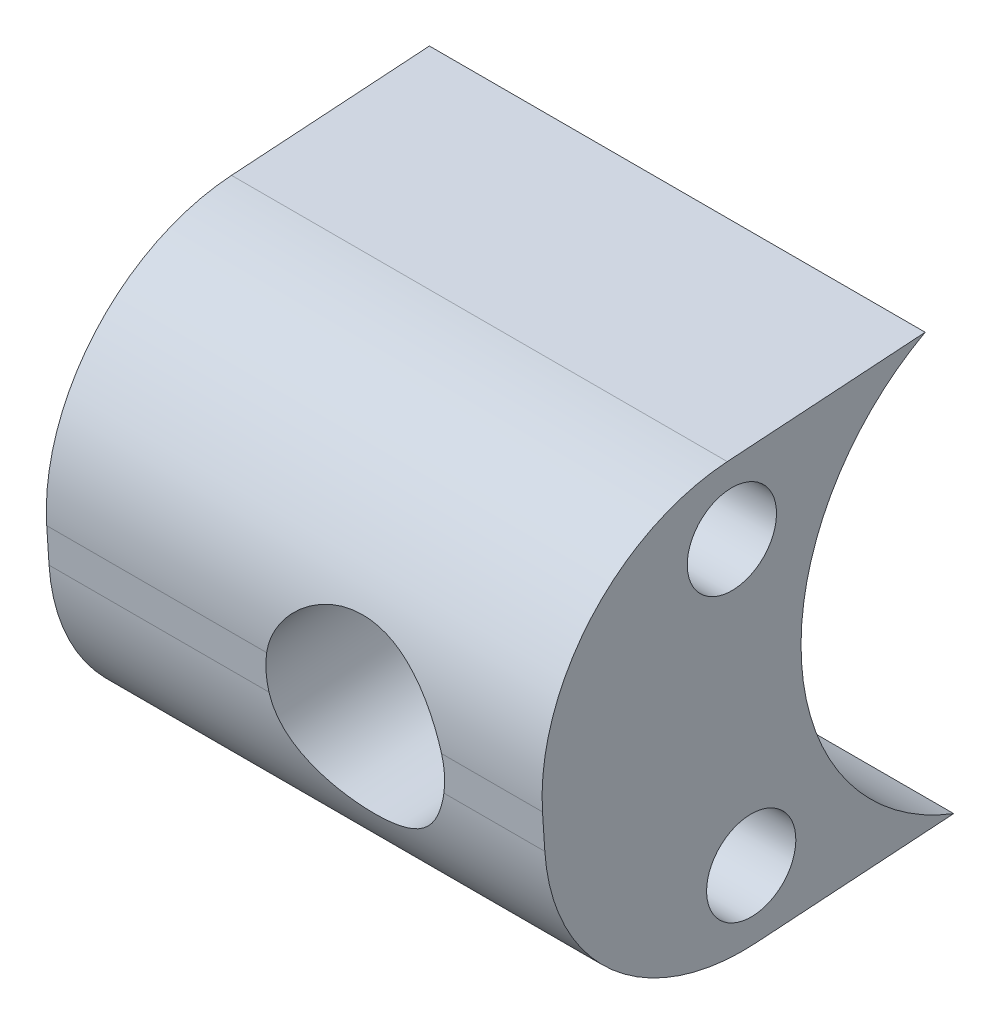
ISO-10303-21;
HEADER;
FILE_DESCRIPTION(('STEP AP214'),'2;1');
FILE_NAME('part.step','',(''),(''),'','','');
FILE_SCHEMA(('AUTOMOTIVE_DESIGN { 1 0 10303 214 1 1 1 1 }'));
ENDSEC;
DATA;
#1=APPLICATION_CONTEXT('core data for automotive mechanical design processes');
#2=APPLICATION_PROTOCOL_DEFINITION('international standard','automotive_design',2000,#1);
#3=PRODUCT_CONTEXT('',#1,'mechanical');
#4=PRODUCT('Part','Part','',(#3));
#5=PRODUCT_RELATED_PRODUCT_CATEGORY('part','',(#4));
#6=PRODUCT_DEFINITION_FORMATION('','',#4);
#7=PRODUCT_DEFINITION_CONTEXT('part definition',#1,'design');
#8=PRODUCT_DEFINITION('design','',#6,#7);
#9=PRODUCT_DEFINITION_SHAPE('','',#8);
#10=(LENGTH_UNIT() NAMED_UNIT(*) SI_UNIT(.MILLI.,.METRE.));
#11=(NAMED_UNIT(*) PLANE_ANGLE_UNIT() SI_UNIT($,.RADIAN.));
#12=(NAMED_UNIT(*) SI_UNIT($,.STERADIAN.) SOLID_ANGLE_UNIT());
#13=UNCERTAINTY_MEASURE_WITH_UNIT(LENGTH_MEASURE(1.E-05),#10,'distance_accuracy_value','');
#14=(GEOMETRIC_REPRESENTATION_CONTEXT(3) GLOBAL_UNCERTAINTY_ASSIGNED_CONTEXT((#13)) GLOBAL_UNIT_ASSIGNED_CONTEXT((#10,
#11,#12)) REPRESENTATION_CONTEXT('',''));
#15=CARTESIAN_POINT('',(0.,0.,0.));
#16=DIRECTION('',(0.,0.,1.));
#17=DIRECTION('',(1.,0.,0.));
#18=AXIS2_PLACEMENT_3D('',#15,#16,#17);
#19=CARTESIAN_POINT('',(15.,38.3574216780718,84.6947004439507));
#20=DIRECTION('',(-1.,0.,0.));
#21=DIRECTION('',(0.,-1.,0.));
#22=AXIS2_PLACEMENT_3D('',#19,#20,#21);
#23=CYLINDRICAL_SURFACE('',#22,0.999999999999998);
#24=CARTESIAN_POINT('',(-10.,38.3574216780718,84.6947004439507));
#25=DIRECTION('',(-1.,0.,0.));
#26=DIRECTION('',(0.,-1.,0.));
#27=AXIS2_PLACEMENT_3D('',#24,#25,#26);
#28=CIRCLE('',#27,0.999999999999998);
#29=CARTESIAN_POINT('',(-10.,37.3574216780718,84.6947004439507));
#30=VERTEX_POINT('',#29);
#31=EDGE_CURVE('E174',#30,#30,#28,.T.);
#32=ORIENTED_EDGE('',*,*,#31,.T.);
#33=EDGE_LOOP('',(#32));
#34=FACE_BOUND('',#33,.T.);
#35=CARTESIAN_POINT('',(2.,38.3574216780718,84.6947004439507));
#36=DIRECTION('',(1.,0.,0.));
#37=DIRECTION('',(0.,1.,0.));
#38=AXIS2_PLACEMENT_3D('',#35,#36,#37);
#39=CIRCLE('',#38,0.999999999999998);
#40=CARTESIAN_POINT('',(2.,39.3574216780718,84.6947004439507));
#41=VERTEX_POINT('',#40);
#42=EDGE_CURVE('E49',#41,#41,#39,.F.);
#43=ORIENTED_EDGE('',*,*,#42,.F.);
#44=EDGE_LOOP('',(#43));
#45=FACE_BOUND('',#44,.T.);
#46=ADVANCED_FACE('F44',(#34,#45),#23,.F.);
#47=CARTESIAN_POINT('',(15.,53.0940315580643,85.669468508596));
#48=DIRECTION('',(-1.,0.,0.));
#49=DIRECTION('',(0.,-1.,0.));
#50=AXIS2_PLACEMENT_3D('',#47,#48,#49);
#51=CYLINDRICAL_SURFACE('',#50,0.999999999999998);
#52=CARTESIAN_POINT('',(-10.,53.0940315580643,85.669468508596));
#53=DIRECTION('',(-1.,0.,0.));
#54=DIRECTION('',(0.,-1.,0.));
#55=AXIS2_PLACEMENT_3D('',#52,#53,#54);
#56=CIRCLE('',#55,0.999999999999998);
#57=CARTESIAN_POINT('',(-10.,52.0940315580643,85.669468508596));
#58=VERTEX_POINT('',#57);
#59=EDGE_CURVE('E189',#58,#58,#56,.T.);
#60=ORIENTED_EDGE('',*,*,#59,.T.);
#61=EDGE_LOOP('',(#60));
#62=FACE_BOUND('',#61,.T.);
#63=CARTESIAN_POINT('',(2.,53.0940315580643,85.669468508596));
#64=DIRECTION('',(1.,0.,0.));
#65=DIRECTION('',(0.,1.,0.));
#66=AXIS2_PLACEMENT_3D('',#63,#64,#65);
#67=CIRCLE('',#66,0.999999999999998);
#68=CARTESIAN_POINT('',(2.,54.0940315580643,85.669468508596));
#69=VERTEX_POINT('',#68);
#70=EDGE_CURVE('E168',#69,#69,#67,.F.);
#71=ORIENTED_EDGE('',*,*,#70,.F.);
#72=EDGE_LOOP('',(#71));
#73=FACE_BOUND('',#72,.T.);
#74=ADVANCED_FACE('F243',(#62,#73),#51,.F.);
#75=CARTESIAN_POINT('',(15.,44.83380683333,85.1230875340005));
#76=DIRECTION('',(-1.,0.,0.));
#77=DIRECTION('',(0.,-1.,0.));
#78=AXIS2_PLACEMENT_3D('',#75,#76,#77);
#79=CYLINDRICAL_SURFACE('',#78,10.);
#80=CARTESIAN_POINT('',(1.08967138884241,44.1737889625631,95.1012825817167));
#81=CARTESIAN_POINT('',(1.11396025224883,44.0541213979482,95.0933850008602));
#82=CARTESIAN_POINT('',(1.14317009994851,43.9356138283809,95.0833665741199));
#83=CARTESIAN_POINT('',(1.21110469602797,43.7018064375716,95.0594995464776));
#84=CARTESIAN_POINT('',(1.24982536628847,43.5865052649948,95.0456525868827));
#85=CARTESIAN_POINT('',(1.3363225034484,43.3602956349309,95.0145876343883));
#86=CARTESIAN_POINT('',(1.38406642874332,43.2493730725805,94.9973817480445));
#87=CARTESIAN_POINT('',(1.48827412981522,43.0322361141684,94.9600838324072));
#88=CARTESIAN_POINT('',(1.54473860925532,42.9260220989312,94.9399915702206));
#89=CARTESIAN_POINT('',(1.72642155145603,42.6157054631113,94.8762632679071));
#90=CARTESIAN_POINT('',(1.86411584633579,42.4194444069645,94.8291055008529));
#91=CARTESIAN_POINT('',(2.16885626868298,42.0524501245451,94.7303940598669));
#92=CARTESIAN_POINT('',(2.33592910344768,41.8817403899959,94.6788364082488));
#93=CARTESIAN_POINT('',(2.70403894676532,41.5618037131869,94.5742063280678));
#94=CARTESIAN_POINT('',(2.90630971320346,41.4139769970336,94.5211777933535));
#95=CARTESIAN_POINT('',(3.3339409039677,41.1534640342692,94.4222577317884));
#96=CARTESIAN_POINT('',(3.55930102269774,41.040777322647,94.3763661104981));
#97=CARTESIAN_POINT('',(4.03015549333476,40.8526367143164,94.2970122979337));
#98=CARTESIAN_POINT('',(4.27584300924976,40.7776032851871,94.2636914599594));
#99=CARTESIAN_POINT('',(4.77793402847609,40.6694017690848,94.2149160823838));
#100=CARTESIAN_POINT('',(5.03433123879787,40.6362094441867,94.1994511995319));
#101=CARTESIAN_POINT('',(5.53380736234976,40.613717815865,94.1890104041689));
#102=CARTESIAN_POINT('',(5.77675002787525,40.621876557938,94.1928478170947));
#103=CARTESIAN_POINT('',(6.25747379314434,40.675959916093,94.2177658534219));
#104=CARTESIAN_POINT('',(6.49525475155304,40.7218855649512,94.2388469483701));
#105=CARTESIAN_POINT('',(6.95491021084694,40.8487279942179,94.2949904425765));
#106=CARTESIAN_POINT('',(7.17699062365971,40.9290165799428,94.3298009949681));
#107=CARTESIAN_POINT('',(7.60458371793245,41.1221698318604,94.4093466809176));
#108=CARTESIAN_POINT('',(7.81009217671615,41.2350427674801,94.4540843331591));
#109=CARTESIAN_POINT('',(8.21160292479085,41.4982477485836,94.5514943550375));
#110=CARTESIAN_POINT('',(8.40634469177015,41.6503856747501,94.6044778914918));
#111=CARTESIAN_POINT('',(8.76801740255451,41.9851738602378,94.710371039208));
#112=CARTESIAN_POINT('',(8.93493169383607,42.1678422596258,94.7632805875504));
#113=CARTESIAN_POINT('',(9.16324915465894,42.4645333722444,94.8389228746239));
#114=CARTESIAN_POINT('',(9.23661897500271,42.5689893172815,94.8638667883204));
#115=CARTESIAN_POINT('',(9.37417325180732,42.7842661182192,94.9114227776624));
#116=CARTESIAN_POINT('',(9.43836163553839,42.8950842241705,94.9340358491395));
#117=CARTESIAN_POINT('',(9.55690452874422,43.1221674370995,94.9761890877605));
#118=CARTESIAN_POINT('',(9.61127544013796,43.2384230427179,94.9957343729335));
#119=CARTESIAN_POINT('',(9.70979317743557,43.4756666755635,95.0311559578355));
#120=CARTESIAN_POINT('',(9.75394637322555,43.5966516991003,95.0470345434298));
#121=CARTESIAN_POINT('',(9.81633736935239,43.7940369290115,95.0691675061754));
#122=CARTESIAN_POINT('',(9.83793556159174,43.869244595736,95.0767501591257));
#123=CARTESIAN_POINT('',(9.87713343309136,44.0207390552473,95.0902690555518));
#124=CARTESIAN_POINT('',(9.89473808502419,44.0970243789548,95.0962073486072));
#125=CARTESIAN_POINT('',(9.9103286111576,44.1737889625631,95.1012825817167));
#126=B_SPLINE_CURVE_WITH_KNOTS('',3,(#80,#81,#82,#83,#84,#85,#86,#87,#88,#89,#90,#91,#92,#93,
#94,#95,#96,#97,#98,#99,#100,#101,#102,#103,#104,#105,#106,#107,#108,#109,#110,#111,#112,#113,
#114,#115,#116,#117,#118,#119,#120,#121,#122,#123,#124,#125),.UNSPECIFIED.,.F.,.F.,(4,2,2,2,2,2,
2,2,2,2,2,2,2,2,2,2,2,2,2,2,2,2,4),(0.,0.36693523797522,0.733713412629058,1.09919323765703,
1.46470256874171,2.19417112472514,2.9243062834031,3.68901878777467,4.45372117220255,
5.22678273239869,5.99939626350478,6.72511322140514,7.4508500254675,8.16385103865879,
8.87703316029591,9.63196002795654,10.3873370500176,10.7771108132416,11.1667173527464,
11.5556668345992,11.9443731819975,12.1801000007903,12.4155316663247),.UNSPECIFIED.);
#127=CARTESIAN_POINT('',(1.08967138884241,44.1737889625631,95.1012825817167));
#128=VERTEX_POINT('',#127);
#129=CARTESIAN_POINT('',(9.91032861115759,44.1737889625631,95.1012825817167));
#130=VERTEX_POINT('',#129);
#131=EDGE_CURVE('E61',#128,#130,#126,.T.);
#132=ORIENTED_EDGE('',*,*,#131,.F.);
#133=DIRECTION('',(-1.,0.,0.));
#134=VECTOR('',#133,1.);
#135=CARTESIAN_POINT('',(15.,44.1737889625631,95.1012825817167));
#136=LINE('',#135,#134);
#137=CARTESIAN_POINT('',(-10.,44.1737889625631,95.1012825817167));
#138=VERTEX_POINT('',#137);
#139=EDGE_CURVE('E97',#128,#138,#136,.T.);
#140=ORIENTED_EDGE('',*,*,#139,.T.);
#141=CARTESIAN_POINT('',(-10.,44.83380683333,85.1230875340005));
#142=DIRECTION('',(1.,0.,0.));
#143=DIRECTION('',(0.,1.,0.));
#144=AXIS2_PLACEMENT_3D('',#141,#142,#143);
#145=CIRCLE('',#144,10.);
#146=CARTESIAN_POINT('',(-10.,34.8556117856138,84.4630696632336));
#147=VERTEX_POINT('',#146);
#148=EDGE_CURVE('E145',#138,#147,#145,.T.);
#149=ORIENTED_EDGE('',*,*,#148,.T.);
#150=DIRECTION('',(-1.,0.,0.));
#151=VECTOR('',#150,1.);
#152=CARTESIAN_POINT('',(15.,34.8556117856138,84.4630696632336));
#153=LINE('',#152,#151);
#154=CARTESIAN_POINT('',(15.,34.8556117856138,84.4630696632336));
#155=VERTEX_POINT('',#154);
#156=EDGE_CURVE('E167',#155,#147,#153,.T.);
#157=ORIENTED_EDGE('',*,*,#156,.F.);
#158=CARTESIAN_POINT('',(15.,44.83380683333,85.1230875340005));
#159=DIRECTION('',(1.,0.,0.));
#160=DIRECTION('',(0.,1.,0.));
#161=AXIS2_PLACEMENT_3D('',#158,#159,#160);
#162=CIRCLE('',#161,10.);
#163=CARTESIAN_POINT('',(15.,44.1737889625631,95.1012825817167));
#164=VERTEX_POINT('',#163);
#165=EDGE_CURVE('E157',#164,#155,#162,.T.);
#166=ORIENTED_EDGE('',*,*,#165,.F.);
#167=EDGE_CURVE('E158',#164,#130,#136,.T.);
#168=ORIENTED_EDGE('',*,*,#167,.T.);
#169=EDGE_LOOP('',(#132,#140,#149,#157,#166,#168));
#170=FACE_BOUND('',#169,.T.);
#171=ADVANCED_FACE('F46',(#170),#79,.T.);
#172=CARTESIAN_POINT('',(15.,46.7178825141239,70.1826041787389));
#173=DIRECTION('',(-1.,0.,0.));
#174=DIRECTION('',(0.,-1.,0.));
#175=AXIS2_PLACEMENT_3D('',#172,#173,#174);
#176=CYLINDRICAL_SURFACE('',#175,11.9999999999999);
#177=CARTESIAN_POINT('',(-10.,46.7178825141239,70.1826041787389));
#178=DIRECTION('',(-1.,0.,0.));
#179=DIRECTION('',(0.,1.,0.));
#180=AXIS2_PLACEMENT_3D('',#177,#178,#179);
#181=CIRCLE('',#180,11.9999999999999);
#182=CARTESIAN_POINT('',(-10.,35.5156296563805,74.4848746155174));
#183=VERTEX_POINT('',#182);
#184=CARTESIAN_POINT('',(-10.,57.2558593212892,75.922904241597));
#185=VERTEX_POINT('',#184);
#186=EDGE_CURVE('E150',#183,#185,#181,.T.);
#187=ORIENTED_EDGE('',*,*,#186,.T.);
#188=DIRECTION('',(-1.,0.,0.));
#189=VECTOR('',#188,1.);
#190=CARTESIAN_POINT('',(15.,57.2558593212892,75.922904241597));
#191=LINE('',#190,#189);
#192=CARTESIAN_POINT('',(15.,57.2558593212892,75.922904241597));
#193=VERTEX_POINT('',#192);
#194=EDGE_CURVE('E135',#193,#185,#191,.T.);
#195=ORIENTED_EDGE('',*,*,#194,.F.);
#196=CARTESIAN_POINT('',(15.,46.7178825141239,70.1826041787389));
#197=DIRECTION('',(-1.,0.,0.));
#198=DIRECTION('',(0.,1.,0.));
#199=AXIS2_PLACEMENT_3D('',#196,#197,#198);
#200=CIRCLE('',#199,11.9999999999999);
#201=CARTESIAN_POINT('',(15.,35.5156296563805,74.4848746155174));
#202=VERTEX_POINT('',#201);
#203=EDGE_CURVE('E122',#202,#193,#200,.T.);
#204=ORIENTED_EDGE('',*,*,#203,.F.);
#205=DIRECTION('',(-1.,0.,0.));
#206=VECTOR('',#205,1.);
#207=CARTESIAN_POINT('',(15.,35.5156296563805,74.4848746155174));
#208=LINE('',#207,#206);
#209=EDGE_CURVE('E164',#202,#183,#208,.T.);
#210=ORIENTED_EDGE('',*,*,#209,.T.);
#211=EDGE_LOOP('',(#187,#195,#204,#210));
#212=FACE_BOUND('',#211,.T.);
#213=CARTESIAN_POINT('',(5.5,50.4738467554008,81.5796534731066));
#214=CARTESIAN_POINT('',(5.62148085015299,50.473847301999,81.5796530104264));
#215=CARTESIAN_POINT('',(5.74295393045808,50.4688023556166,81.5813195483258));
#216=CARTESIAN_POINT('',(5.98501683379221,50.4486801122398,81.587921438461));
#217=CARTESIAN_POINT('',(6.10560635791962,50.4335995655592,81.5928578495311));
#218=CARTESIAN_POINT('',(6.34491802960832,50.393573809666,81.6058146044817));
#219=CARTESIAN_POINT('',(6.46364096274915,50.3686328725211,81.6138336127685));
#220=CARTESIAN_POINT('',(6.69844825395936,50.3091570600624,81.6326569482766));
#221=CARTESIAN_POINT('',(6.814531547746,50.2746183866947,81.6434623780294));
#222=CARTESIAN_POINT('',(7.15697963287564,50.1572914864506,81.6794395771095));
#223=CARTESIAN_POINT('',(7.37838685671572,50.0606488319617,81.7082222450357));
#224=CARTESIAN_POINT('',(7.80215501551259,49.8337280957961,81.7716207039512));
#225=CARTESIAN_POINT('',(8.00451020466555,49.7034399111973,81.806238245923));
#226=CARTESIAN_POINT('',(8.3946596950267,49.4061868584396,81.8786470960932));
#227=CARTESIAN_POINT('',(8.5813825735521,49.2378305012339,81.9165111333001));
#228=CARTESIAN_POINT('',(8.92517145999286,48.8725209989377,81.989050690162));
#229=CARTESIAN_POINT('',(9.08223114179316,48.6755617696692,82.0237255288662));
#230=CARTESIAN_POINT('',(9.36741768839757,48.2506428969225,82.0863112691364));
#231=CARTESIAN_POINT('',(9.49437819716836,48.0218564447158,82.1139518642006));
#232=CARTESIAN_POINT('',(9.70795374447513,47.5450583165044,82.1564484170222));
#233=CARTESIAN_POINT('',(9.7945827755198,47.2970533430127,82.1713088102312));
#234=CARTESIAN_POINT('',(9.92127363034827,46.8003653655026,82.1847797921686));
#235=CARTESIAN_POINT('',(9.96318286708289,46.5521730087158,82.1840636362558));
#236=CARTESIAN_POINT('',(10.0051636180685,46.0528496259115,82.1667626437535));
#237=CARTESIAN_POINT('',(10.0052487368418,45.8017195820437,82.1501829689973));
#238=CARTESIAN_POINT('',(9.964654711816,45.3168359034364,82.1029027297557));
#239=CARTESIAN_POINT('',(9.925992105138,45.0828372686778,82.0729413539277));
#240=CARTESIAN_POINT('',(9.81239225533897,44.62576189034,82.0010888762818));
#241=CARTESIAN_POINT('',(9.73745244348751,44.402685921409,81.9591969297659));
#242=CARTESIAN_POINT('',(9.55248864469485,43.9698092061367,81.8658347328824));
#243=CARTESIAN_POINT('',(9.44196998412167,43.7602488783712,81.8142339706075));
#244=CARTESIAN_POINT('',(9.18942370928497,43.3625540960715,81.7058121136094));
#245=CARTESIAN_POINT('',(9.04738593096199,43.1744265827215,81.6489893383997));
#246=CARTESIAN_POINT('',(8.72611814113479,42.8130689582521,81.5312009565962));
#247=CARTESIAN_POINT('',(8.54519825306621,42.6413545587446,81.4701874828732));
#248=CARTESIAN_POINT('',(8.15622102001783,42.3299483659201,81.3528231120319));
#249=CARTESIAN_POINT('',(7.94815688015444,42.1902646148985,81.2964733881585));
#250=CARTESIAN_POINT('',(7.50484159768235,41.9438054008434,81.192895549685));
#251=CARTESIAN_POINT('',(7.2690895192424,41.8378291838365,81.1458976587443));
#252=CARTESIAN_POINT('',(6.78071132480879,41.6667105791412,81.0681267903962));
#253=CARTESIAN_POINT('',(6.52809468531154,41.60154546916,81.0373447860314));
#254=CARTESIAN_POINT('',(6.02807211298671,41.5170597176286,80.9971094744687));
#255=CARTESIAN_POINT('',(5.78114768337417,41.4954080429632,80.9865730907702));
#256=CARTESIAN_POINT('',(5.2869719297922,41.4917847331895,80.9848227573929));
#257=CARTESIAN_POINT('',(5.03972070294683,41.5098031822693,80.9936039791496));
#258=CARTESIAN_POINT('',(4.56421023313294,41.5829439744849,81.0285199751731));
#259=CARTESIAN_POINT('',(4.33560659270609,41.6362644286683,81.0538112054115));
#260=CARTESIAN_POINT('',(3.89095616583936,41.7763458372491,81.1181935389583));
#261=CARTESIAN_POINT('',(3.67491196249131,41.8631136429374,81.1572874694471));
#262=CARTESIAN_POINT('',(3.25250668577584,42.0714627398638,81.2471456434825));
#263=CARTESIAN_POINT('',(3.04681212360605,42.1942270620617,81.2982924066849));
#264=CARTESIAN_POINT('',(2.65861305480381,42.4700768948723,81.4065997142529));
#265=CARTESIAN_POINT('',(2.47611707605825,42.6231735031382,81.4637624560812));
#266=CARTESIAN_POINT('',(2.12749488048686,42.9670823657375,81.5828943408636));
#267=CARTESIAN_POINT('',(1.96313977397107,43.1596702784666,81.6449384582598));
#268=CARTESIAN_POINT('',(1.66948489695435,43.571191854069,81.7646678553192));
#269=CARTESIAN_POINT('',(1.54018524012531,43.7901256023686,81.8223531208477));
#270=CARTESIAN_POINT('',(1.32116183243475,44.2482271822355,81.9280630012724));
#271=CARTESIAN_POINT('',(1.23130263247398,44.4873223466831,81.9761203668513));
#272=CARTESIAN_POINT('',(1.09403075460028,44.9796060611105,82.0586535974415));
#273=CARTESIAN_POINT('',(1.04659812936917,45.2327879285346,82.093135840671));
#274=CARTESIAN_POINT('',(0.997676805262055,45.7302254639145,82.1443517995318));
#275=CARTESIAN_POINT('',(0.993671599938183,45.9741414027063,82.1620027791126));
#276=CARTESIAN_POINT('',(1.02524542922697,46.4599994710446,82.1822954080322));
#277=CARTESIAN_POINT('',(1.06081968975579,46.7019418350984,82.1849388673467));
#278=CARTESIAN_POINT('',(1.16877673292065,47.1709104959494,82.1762896708941));
#279=CARTESIAN_POINT('',(1.24024037594554,47.3981566884394,82.1653354224097));
#280=CARTESIAN_POINT('',(1.41702938171797,47.8381744015684,82.1322351645274));
#281=CARTESIAN_POINT('',(1.52236115443175,48.0509431729313,82.1100870360939));
#282=CARTESIAN_POINT('',(1.76894438921644,48.4656124653971,82.0565667689203));
#283=CARTESIAN_POINT('',(1.91151965651236,48.6666801512938,82.0248460235189));
#284=CARTESIAN_POINT('',(2.2264137521121,49.0430864094223,81.95673188882));
#285=CARTESIAN_POINT('',(2.39874319718877,49.2184157563391,81.9203368328441));
#286=CARTESIAN_POINT('',(2.77923071633569,49.5477396251516,81.8454488176963));
#287=CARTESIAN_POINT('',(2.98879974364199,49.7001197174485,81.8069465160786));
#288=CARTESIAN_POINT('',(3.32064905738238,49.9003122661241,81.7531239931263));
#289=CARTESIAN_POINT('',(3.4342590791725,49.9623438395945,81.7358285869463));
#290=CARTESIAN_POINT('',(3.66662900806166,50.0764375565835,81.7031782191768));
#291=CARTESIAN_POINT('',(3.78538668929151,50.1285039573685,81.6878224299125));
#292=CARTESIAN_POINT('',(4.03263636806404,50.2242473556017,81.6590156782766));
#293=CARTESIAN_POINT('',(4.16132639113602,50.2674482071724,81.645679816894));
#294=CARTESIAN_POINT('',(4.42235960371335,50.3418999555806,81.6223603528025));
#295=CARTESIAN_POINT('',(4.55470112240789,50.3731562237605,81.6123752435454));
#296=CARTESIAN_POINT('',(4.82189249403902,50.423330747913,81.5962079186782));
#297=CARTESIAN_POINT('',(4.95674154874436,50.4422528633691,81.59002451351));
#298=CARTESIAN_POINT('',(5.22773042327554,50.4675098235063,81.5817477895544));
#299=CARTESIAN_POINT('',(5.36387008999939,50.4738461428897,81.5796539915801));
#300=CARTESIAN_POINT('',(5.5,50.4738467554008,81.5796534731066));
#301=B_SPLINE_CURVE_WITH_KNOTS('',3,(#213,#214,#215,#216,#217,#218,#219,#220,#221,#222,#223,
#224,#225,#226,#227,#228,#229,#230,#231,#232,#233,#234,#235,#236,#237,#238,#239,#240,#241,#242,
#243,#244,#245,#246,#247,#248,#249,#250,#251,#252,#253,#254,#255,#256,#257,#258,#259,#260,#261,
#262,#263,#264,#265,#266,#267,#268,#269,#270,#271,#272,#273,#274,#275,#276,#277,#278,#279,#280,
#281,#282,#283,#284,#285,#286,#287,#288,#289,#290,#291,#292,#293,#294,#295,#296,#297,#298,#299,
#300),.UNSPECIFIED.,.T.,.F.,(4,2,2,2,2,2,2,2,2,2,2,2,2,2,2,2,2,2,2,2,2,2,2,2,2,2,2,2,2,2,2,2,2,
2,2,2,2,2,2,2,2,2,2,4),(0.,0.364312890801976,0.728743809325293,1.09301700890669,
1.45743456590095,2.18372869237547,2.91024116115318,3.66958869413821,4.42909798679386,
5.21445128619702,5.99953191354429,6.75074967679477,7.50172308425011,8.21554330620023,
8.92941408000446,9.65367305842442,10.3781659309737,11.1450493740806,11.9121251569244,
12.6962268897519,13.4798916712983,14.2203188544486,14.9605609839006,15.66566450008,
16.3709125251198,17.1025959524087,17.8345475762247,18.6128996320428,19.3912542117394,
20.1669143889391,20.9422096890378,21.6723207387321,22.4023437318184,23.1145573423507,
23.826905827619,24.5691988325436,25.311757249083,26.0935071084964,26.4848788226903,
26.8760829621587,27.2846870621149,27.6931072006589,28.1013994789094,28.5096439139334),.UNSPECIFIED.);
#302=CARTESIAN_POINT('',(5.5,50.4738467554008,81.5796534731066));
#303=VERTEX_POINT('',#302);
#304=EDGE_CURVE('E148',#303,#303,#301,.T.);
#305=ORIENTED_EDGE('',*,*,#304,.F.);
#306=EDGE_LOOP('',(#305));
#307=FACE_BOUND('',#306,.T.);
#308=ADVANCED_FACE('F229',(#212,#307),#176,.F.);
#309=CARTESIAN_POINT('',(15.,46.6176464028061,85.2410814185463));
#310=DIRECTION('',(-1.,0.,0.));
#311=DIRECTION('',(0.,-1.,0.));
#312=AXIS2_PLACEMENT_3D('',#309,#310,#311);
#313=CYLINDRICAL_SURFACE('',#312,10.);
#314=CARTESIAN_POINT('',(9.9103286111576,45.9576285320392,95.2192764662625));
#315=CARTESIAN_POINT('',(9.88603974775118,46.0772937320871,95.2272097948021));
#316=CARTESIAN_POINT('',(9.85682990005151,46.1960883922988,95.2328879656607));
#317=CARTESIAN_POINT('',(9.78889530397205,46.4310024060414,95.2400249925529));
#318=CARTESIAN_POINT('',(9.75017463371154,46.5471228829477,95.2414856535859));
#319=CARTESIAN_POINT('',(9.66367749655161,46.7754534112266,95.2404867226568));
#320=CARTESIAN_POINT('',(9.6159335712567,46.8876758499503,95.2380409896049));
#321=CARTESIAN_POINT('',(9.5117258701848,47.1078337313322,95.2296683863791));
#322=CARTESIAN_POINT('',(9.4552613907447,47.2157688271596,95.2237412351806));
#323=CARTESIAN_POINT('',(9.27357844854398,47.5317758586037,95.201441749532));
#324=CARTESIAN_POINT('',(9.13588415366423,47.7325384160654,95.180545513631));
#325=CARTESIAN_POINT('',(8.83114373131704,48.1093371217441,95.1310330171382));
#326=CARTESIAN_POINT('',(8.66407089655234,48.2853505068326,95.102409719286));
#327=CARTESIAN_POINT('',(8.29596105323471,48.6162811729097,95.0408319221831));
#328=CARTESIAN_POINT('',(8.09369028679657,48.7698046457115,95.0077365025381));
#329=CARTESIAN_POINT('',(7.66605909603233,49.0410772258435,94.9439919371472));
#330=CARTESIAN_POINT('',(7.44069897730229,49.1588268065725,94.9133427590341));
#331=CARTESIAN_POINT('',(6.96984450666528,49.3557803913819,94.8594613939599));
#332=CARTESIAN_POINT('',(6.72415699075027,49.4345489727404,94.8363139465635));
#333=CARTESIAN_POINT('',(6.22206597152395,49.5482322711849,94.8022153659589));
#334=CARTESIAN_POINT('',(5.96566876120217,49.5831723773927,94.7912571721318));
#335=CARTESIAN_POINT('',(5.46619263765028,49.6068432651349,94.7838698433943));
#336=CARTESIAN_POINT('',(5.22324997212478,49.5982501581851,94.7865991882106));
#337=CARTESIAN_POINT('',(4.7425262068557,49.5413559021437,94.8041764972545));
#338=CARTESIAN_POINT('',(4.504745248447,49.4930536671638,94.8190247928878));
#339=CARTESIAN_POINT('',(4.04508978915309,49.3599213670433,94.8579719939246));
#340=CARTESIAN_POINT('',(3.82300937634033,49.2757471956545,94.8819039897986));
#341=CARTESIAN_POINT('',(3.39541628206758,49.0737993670289,94.9353153125019));
#342=CARTESIAN_POINT('',(3.18990782328388,48.956017180662,94.9647960468573));
#343=CARTESIAN_POINT('',(2.78839707520918,48.6822749323211,95.0266891475494));
#344=CARTESIAN_POINT('',(2.59365530822988,48.5244837377808,95.059172106759));
#345=CARTESIAN_POINT('',(2.23198259744551,48.1786645904992,95.1200457894864));
#346=CARTESIAN_POINT('',(2.06506830616395,47.9906186640233,95.1484340613004));
#347=CARTESIAN_POINT('',(1.83675084534108,47.6865491844631,95.1843384273376));
#348=CARTESIAN_POINT('',(1.76338102499732,47.5797178028251,95.1953065256882));
#349=CARTESIAN_POINT('',(1.6258267481927,47.3600527225689,95.2140928414609));
#350=CARTESIAN_POINT('',(1.56163836446163,47.2472216187744,95.2219124082502));
#351=CARTESIAN_POINT('',(1.44309547125579,47.016564616873,95.2337879543113));
#352=CARTESIAN_POINT('',(1.38872455986205,46.8987474632201,95.2378502585003));
#353=CARTESIAN_POINT('',(1.29020682256444,46.6589052285317,95.2417145129475));
#354=CARTESIAN_POINT('',(1.24605362677446,46.5368828239326,95.2415191247889));
#355=CARTESIAN_POINT('',(1.18366263064762,46.3383020476814,95.2374605129026));
#356=CARTESIAN_POINT('',(1.16206443840827,46.2627508708799,95.2350710686522));
#357=CARTESIAN_POINT('',(1.12286656690864,46.110795651114,95.2285179770842));
#358=CARTESIAN_POINT('',(1.10526191497581,46.0343927944677,95.22435655499));
#359=CARTESIAN_POINT('',(1.0896713888424,45.9576285320392,95.2192764662625));
#360=B_SPLINE_CURVE_WITH_KNOTS('',3,(#314,#315,#316,#317,#318,#319,#320,#321,#322,#323,#324,
#325,#326,#327,#328,#329,#330,#331,#332,#333,#334,#335,#336,#337,#338,#339,#340,#341,#342,#343,
#344,#345,#346,#347,#348,#349,#350,#351,#352,#353,#354,#355,#356,#357,#358,#359),.UNSPECIFIED.,
.F.,.F.,(4,2,2,2,2,2,2,2,2,2,2,2,2,2,2,2,2,2,2,2,2,2,4),(0.,0.366935237975214,0.733713412629054,
1.09919323765703,1.46470256874171,2.19417112472514,2.9243062834031,3.68901878777467,
4.45372117220255,5.22678273239869,5.99939626350477,6.72511322140514,7.4508500254675,
8.16385103865879,8.87703316029591,9.63196002795654,10.3873370500176,10.7771108132416,
11.1667173527464,11.5556668345992,11.9443731819975,12.1801000007904,12.4155316663248),.UNSPECIFIED.);
#361=CARTESIAN_POINT('',(9.9103286111576,45.9576285320392,95.2192764662625));
#362=VERTEX_POINT('',#361);
#363=CARTESIAN_POINT('',(1.0896713888424,45.9576285320392,95.2192764662625));
#364=VERTEX_POINT('',#363);
#365=EDGE_CURVE('E192',#362,#364,#360,.T.);
#366=ORIENTED_EDGE('',*,*,#365,.F.);
#367=DIRECTION('',(-1.,0.,0.));
#368=VECTOR('',#367,1.);
#369=CARTESIAN_POINT('',(15.,45.9576285320392,95.2192764662625));
#370=LINE('',#369,#368);
#371=CARTESIAN_POINT('',(15.,45.9576285320392,95.2192764662625));
#372=VERTEX_POINT('',#371);
#373=EDGE_CURVE('E136',#372,#362,#370,.T.);
#374=ORIENTED_EDGE('',*,*,#373,.F.);
#375=CARTESIAN_POINT('',(15.,46.6176464028061,85.2410814185463));
#376=DIRECTION('',(1.,0.,0.));
#377=DIRECTION('',(0.,1.,0.));
#378=AXIS2_PLACEMENT_3D('',#375,#376,#377);
#379=CIRCLE('',#378,10.);
#380=CARTESIAN_POINT('',(15.,56.5958414505223,85.9010992893132));
#381=VERTEX_POINT('',#380);
#382=EDGE_CURVE('E119',#381,#372,#379,.T.);
#383=ORIENTED_EDGE('',*,*,#382,.F.);
#384=DIRECTION('',(-1.,0.,0.));
#385=VECTOR('',#384,1.);
#386=CARTESIAN_POINT('',(15.,56.5958414505223,85.9010992893132));
#387=LINE('',#386,#385);
#388=CARTESIAN_POINT('',(-10.,56.5958414505223,85.9010992893132));
#389=VERTEX_POINT('',#388);
#390=EDGE_CURVE('E128',#381,#389,#387,.T.);
#391=ORIENTED_EDGE('',*,*,#390,.T.);
#392=CARTESIAN_POINT('',(-10.,46.6176464028061,85.2410814185463));
#393=DIRECTION('',(1.,0.,0.));
#394=DIRECTION('',(0.,1.,0.));
#395=AXIS2_PLACEMENT_3D('',#392,#393,#394);
#396=CIRCLE('',#395,10.);
#397=CARTESIAN_POINT('',(-10.,45.9576285320392,95.2192764662625));
#398=VERTEX_POINT('',#397);
#399=EDGE_CURVE('E153',#389,#398,#396,.T.);
#400=ORIENTED_EDGE('',*,*,#399,.T.);
#401=EDGE_CURVE('E161',#364,#398,#370,.T.);
#402=ORIENTED_EDGE('',*,*,#401,.F.);
#403=EDGE_LOOP('',(#366,#374,#383,#391,#400,#402));
#404=FACE_BOUND('',#403,.T.);
#405=ADVANCED_FACE('F139',(#404),#313,.T.);
#406=CARTESIAN_POINT('',(15.,44.1737889625631,95.1012825817167));
#407=DIRECTION('',(0.,0.0660017870766993,-0.997819504771621));
#408=DIRECTION('',(0.,0.997819504771621,0.0660017870766993));
#409=AXIS2_PLACEMENT_3D('',#406,#407,#408);
#410=PLANE('',#409);
#411=CARTESIAN_POINT('',(5.5,45.0657087473011,95.1602795239896));
#412=DIRECTION('',(0.,0.0660017870766993,-0.997819504771621));
#413=DIRECTION('',(0.,0.997819504771621,0.0660017870766993));
#414=AXIS2_PLACEMENT_3D('',#411,#412,#413);
#415=CIRCLE('',#414,4.5);
#416=EDGE_CURVE('E13',#364,#128,#415,.F.);
#417=ORIENTED_EDGE('',*,*,#416,.F.);
#418=ORIENTED_EDGE('',*,*,#401,.T.);
#419=DIRECTION('',(0.,-0.997819504771621,-0.0660017870766993));
#420=VECTOR('',#419,1.);
#421=CARTESIAN_POINT('',(-10.,44.1737889625631,95.1012825817167));
#422=LINE('',#421,#420);
#423=EDGE_CURVE('E155',#398,#138,#422,.T.);
#424=ORIENTED_EDGE('',*,*,#423,.T.);
#425=ORIENTED_EDGE('',*,*,#139,.F.);
#426=EDGE_LOOP('',(#417,#418,#424,#425));
#427=FACE_BOUND('',#426,.T.);
#428=ADVANCED_FACE('F235',(#427),#410,.F.);
#429=CARTESIAN_POINT('',(15.,35.5156296563807,74.4848746155174));
#430=DIRECTION('',(0.,0.997819504771621,0.0660017870766922));
#431=DIRECTION('',(0.,-0.0660017870766923,0.997819504771621));
#432=AXIS2_PLACEMENT_3D('',#429,#430,#431);
#433=PLANE('',#432);
#434=DIRECTION('',(0.,0.0660017870766922,-0.997819504771621));
#435=VECTOR('',#434,1.);
#436=CARTESIAN_POINT('',(-10.,35.5156296563807,74.4848746155174));
#437=LINE('',#436,#435);
#438=EDGE_CURVE('E147',#147,#183,#437,.T.);
#439=ORIENTED_EDGE('',*,*,#438,.T.);
#440=ORIENTED_EDGE('',*,*,#209,.F.);
#441=DIRECTION('',(0.,0.0660017870766922,-0.997819504771621));
#442=VECTOR('',#441,1.);
#443=CARTESIAN_POINT('',(15.,35.5156296563807,74.4848746155174));
#444=LINE('',#443,#442);
#445=EDGE_CURVE('E106',#155,#202,#444,.T.);
#446=ORIENTED_EDGE('',*,*,#445,.F.);
#447=ORIENTED_EDGE('',*,*,#156,.T.);
#448=EDGE_LOOP('',(#439,#440,#446,#447));
#449=FACE_BOUND('',#448,.T.);
#450=ADVANCED_FACE('F233',(#449),#433,.F.);
#451=CARTESIAN_POINT('',(15.,56.5958414505223,85.9010992893132));
#452=DIRECTION('',(0.,-0.997819504771621,-0.0660017870766922));
#453=DIRECTION('',(0.,0.0660017870766923,-0.997819504771621));
#454=AXIS2_PLACEMENT_3D('',#451,#452,#453);
#455=PLANE('',#454);
#456=DIRECTION('',(0.,-0.0660017870766922,0.997819504771621));
#457=VECTOR('',#456,1.);
#458=CARTESIAN_POINT('',(-10.,56.5958414505223,85.9010992893132));
#459=LINE('',#458,#457);
#460=EDGE_CURVE('E131',#185,#389,#459,.T.);
#461=ORIENTED_EDGE('',*,*,#460,.T.);
#462=ORIENTED_EDGE('',*,*,#390,.F.);
#463=DIRECTION('',(0.,-0.0660017870766922,0.997819504771621));
#464=VECTOR('',#463,1.);
#465=CARTESIAN_POINT('',(15.,56.5958414505223,85.9010992893132));
#466=LINE('',#465,#464);
#467=EDGE_CURVE('E115',#193,#381,#466,.T.);
#468=ORIENTED_EDGE('',*,*,#467,.F.);
#469=ORIENTED_EDGE('',*,*,#194,.T.);
#470=EDGE_LOOP('',(#461,#462,#468,#469));
#471=FACE_BOUND('',#470,.T.);
#472=ADVANCED_FACE('F129',(#471),#455,.F.);
#473=EDGE_CURVE('E54',#130,#362,#415,.F.);
#474=ORIENTED_EDGE('',*,*,#473,.F.);
#475=ORIENTED_EDGE('',*,*,#167,.F.);
#476=DIRECTION('',(0.,-0.997819504771621,-0.0660017870766993));
#477=VECTOR('',#476,1.);
#478=CARTESIAN_POINT('',(15.,44.1737889625631,95.1012825817167));
#479=LINE('',#478,#477);
#480=EDGE_CURVE('E70',#372,#164,#479,.T.);
#481=ORIENTED_EDGE('',*,*,#480,.F.);
#482=ORIENTED_EDGE('',*,*,#373,.T.);
#483=EDGE_LOOP('',(#474,#475,#481,#482));
#484=FACE_BOUND('',#483,.T.);
#485=ADVANCED_FACE('F240',(#484),#410,.F.);
#486=CARTESIAN_POINT('',(15.,44.83380683333,85.1230875340005));
#487=DIRECTION('',(1.,0.,0.));
#488=DIRECTION('',(0.,1.,0.));
#489=AXIS2_PLACEMENT_3D('',#486,#487,#488);
#490=PLANE('',#489);
#491=CARTESIAN_POINT('',(15.,38.3574216780718,84.6947004439507));
#492=DIRECTION('',(1.,0.,0.));
#493=DIRECTION('',(0.,1.,0.));
#494=AXIS2_PLACEMENT_3D('',#491,#492,#493);
#495=CIRCLE('',#494,2.25);
#496=CARTESIAN_POINT('',(15.,40.6074216780718,84.6947004439507));
#497=VERTEX_POINT('',#496);
#498=EDGE_CURVE('E176',#497,#497,#495,.T.);
#499=ORIENTED_EDGE('',*,*,#498,.F.);
#500=EDGE_LOOP('',(#499));
#501=FACE_BOUND('',#500,.T.);
#502=CARTESIAN_POINT('',(15.,53.0940315580643,85.669468508596));
#503=DIRECTION('',(1.,0.,0.));
#504=DIRECTION('',(0.,1.,0.));
#505=AXIS2_PLACEMENT_3D('',#502,#503,#504);
#506=CIRCLE('',#505,2.25);
#507=CARTESIAN_POINT('',(15.,55.3440315580643,85.669468508596));
#508=VERTEX_POINT('',#507);
#509=EDGE_CURVE('E186',#508,#508,#506,.T.);
#510=ORIENTED_EDGE('',*,*,#509,.F.);
#511=EDGE_LOOP('',(#510));
#512=FACE_BOUND('',#511,.T.);
#513=ORIENTED_EDGE('',*,*,#165,.T.);
#514=ORIENTED_EDGE('',*,*,#445,.T.);
#515=ORIENTED_EDGE('',*,*,#203,.T.);
#516=ORIENTED_EDGE('',*,*,#467,.T.);
#517=ORIENTED_EDGE('',*,*,#382,.T.);
#518=ORIENTED_EDGE('',*,*,#480,.T.);
#519=EDGE_LOOP('',(#513,#514,#515,#516,#517,#518));
#520=FACE_BOUND('',#519,.T.);
#521=ADVANCED_FACE('F117',(#501,#512,#520),#490,.T.);
#522=CARTESIAN_POINT('',(-10.,44.83380683333,85.1230875340005));
#523=DIRECTION('',(1.,0.,0.));
#524=DIRECTION('',(0.,1.,0.));
#525=AXIS2_PLACEMENT_3D('',#522,#523,#524);
#526=PLANE('',#525);
#527=ORIENTED_EDGE('',*,*,#59,.F.);
#528=EDGE_LOOP('',(#527));
#529=FACE_BOUND('',#528,.T.);
#530=ORIENTED_EDGE('',*,*,#31,.F.);
#531=EDGE_LOOP('',(#530));
#532=FACE_BOUND('',#531,.T.);
#533=ORIENTED_EDGE('',*,*,#148,.F.);
#534=ORIENTED_EDGE('',*,*,#423,.F.);
#535=ORIENTED_EDGE('',*,*,#399,.F.);
#536=ORIENTED_EDGE('',*,*,#460,.F.);
#537=ORIENTED_EDGE('',*,*,#186,.F.);
#538=ORIENTED_EDGE('',*,*,#438,.F.);
#539=EDGE_LOOP('',(#533,#534,#535,#536,#537,#538));
#540=FACE_BOUND('',#539,.T.);
#541=ADVANCED_FACE('F217',(#529,#532,#540),#526,.F.);
#542=CARTESIAN_POINT('',(5.50000000000001,46.4804500577172,73.7721241987562));
#543=DIRECTION('',(0.,0.0660017870766922,-0.997819504771621));
#544=DIRECTION('',(0.,0.997819504771621,0.0660017870766922));
#545=AXIS2_PLACEMENT_3D('',#542,#543,#544);
#546=CYLINDRICAL_SURFACE('',#545,4.5);
#547=ORIENTED_EDGE('',*,*,#416,.T.);
#548=ORIENTED_EDGE('',*,*,#131,.T.);
#549=ORIENTED_EDGE('',*,*,#473,.T.);
#550=ORIENTED_EDGE('',*,*,#365,.T.);
#551=EDGE_LOOP('',(#547,#548,#549,#550));
#552=FACE_BOUND('',#551,.T.);
#553=ORIENTED_EDGE('',*,*,#304,.T.);
#554=EDGE_LOOP('',(#553));
#555=FACE_BOUND('',#554,.T.);
#556=ADVANCED_FACE('F211',(#552,#555),#546,.F.);
#557=CARTESIAN_POINT('',(2.,53.0940315580643,85.669468508596));
#558=DIRECTION('',(1.,0.,0.));
#559=DIRECTION('',(0.,1.,0.));
#560=AXIS2_PLACEMENT_3D('',#557,#558,#559);
#561=PLANE('',#560);
#562=CARTESIAN_POINT('',(2.,53.0940315580643,85.669468508596));
#563=DIRECTION('',(1.,0.,0.));
#564=DIRECTION('',(0.,1.,0.));
#565=AXIS2_PLACEMENT_3D('',#562,#563,#564);
#566=CIRCLE('',#565,2.25);
#567=CARTESIAN_POINT('',(2.,55.3440315580643,85.669468508596));
#568=VERTEX_POINT('',#567);
#569=EDGE_CURVE('E181',#568,#568,#566,.T.);
#570=ORIENTED_EDGE('',*,*,#569,.T.);
#571=EDGE_LOOP('',(#570));
#572=FACE_BOUND('',#571,.T.);
#573=ORIENTED_EDGE('',*,*,#70,.T.);
#574=EDGE_LOOP('',(#573));
#575=FACE_BOUND('',#574,.T.);
#576=ADVANCED_FACE('F216',(#572,#575),#561,.T.);
#577=CARTESIAN_POINT('',(2.,53.0940315580643,85.669468508596));
#578=DIRECTION('',(1.,0.,0.));
#579=DIRECTION('',(0.,1.,0.));
#580=AXIS2_PLACEMENT_3D('',#577,#578,#579);
#581=CYLINDRICAL_SURFACE('',#580,2.25);
#582=ORIENTED_EDGE('',*,*,#569,.F.);
#583=EDGE_LOOP('',(#582));
#584=FACE_BOUND('',#583,.T.);
#585=ORIENTED_EDGE('',*,*,#509,.T.);
#586=EDGE_LOOP('',(#585));
#587=FACE_BOUND('',#586,.T.);
#588=ADVANCED_FACE('F256',(#584,#587),#581,.F.);
#589=CARTESIAN_POINT('',(2.,38.3574216780718,84.6947004439507));
#590=DIRECTION('',(1.,0.,0.));
#591=DIRECTION('',(0.,1.,0.));
#592=AXIS2_PLACEMENT_3D('',#589,#590,#591);
#593=PLANE('',#592);
#594=CARTESIAN_POINT('',(2.,38.3574216780718,84.6947004439507));
#595=DIRECTION('',(1.,0.,0.));
#596=DIRECTION('',(0.,1.,0.));
#597=AXIS2_PLACEMENT_3D('',#594,#595,#596);
#598=CIRCLE('',#597,2.25);
#599=CARTESIAN_POINT('',(2.,40.6074216780718,84.6947004439507));
#600=VERTEX_POINT('',#599);
#601=EDGE_CURVE('E170',#600,#600,#598,.T.);
#602=ORIENTED_EDGE('',*,*,#601,.T.);
#603=EDGE_LOOP('',(#602));
#604=FACE_BOUND('',#603,.T.);
#605=ORIENTED_EDGE('',*,*,#42,.T.);
#606=EDGE_LOOP('',(#605));
#607=FACE_BOUND('',#606,.T.);
#608=ADVANCED_FACE('F253',(#604,#607),#593,.T.);
#609=CARTESIAN_POINT('',(2.,38.3574216780718,84.6947004439507));
#610=DIRECTION('',(1.,0.,0.));
#611=DIRECTION('',(0.,1.,0.));
#612=AXIS2_PLACEMENT_3D('',#609,#610,#611);
#613=CYLINDRICAL_SURFACE('',#612,2.25);
#614=ORIENTED_EDGE('',*,*,#601,.F.);
#615=EDGE_LOOP('',(#614));
#616=FACE_BOUND('',#615,.T.);
#617=ORIENTED_EDGE('',*,*,#498,.T.);
#618=EDGE_LOOP('',(#617));
#619=FACE_BOUND('',#618,.T.);
#620=ADVANCED_FACE('F255',(#616,#619),#613,.F.);
#621=CLOSED_SHELL('',(#46,#74,#171,#308,#405,#428,#450,#472,#485,#521,#541,#556,#576,#588,#608,#620));
#622=MANIFOLD_SOLID_BREP('B2',#621);
#623=ADVANCED_BREP_SHAPE_REPRESENTATION('',(#18,#622),#14);
#624=SHAPE_DEFINITION_REPRESENTATION(#9,#623);
ENDSEC;
END-ISO-10303-21;
